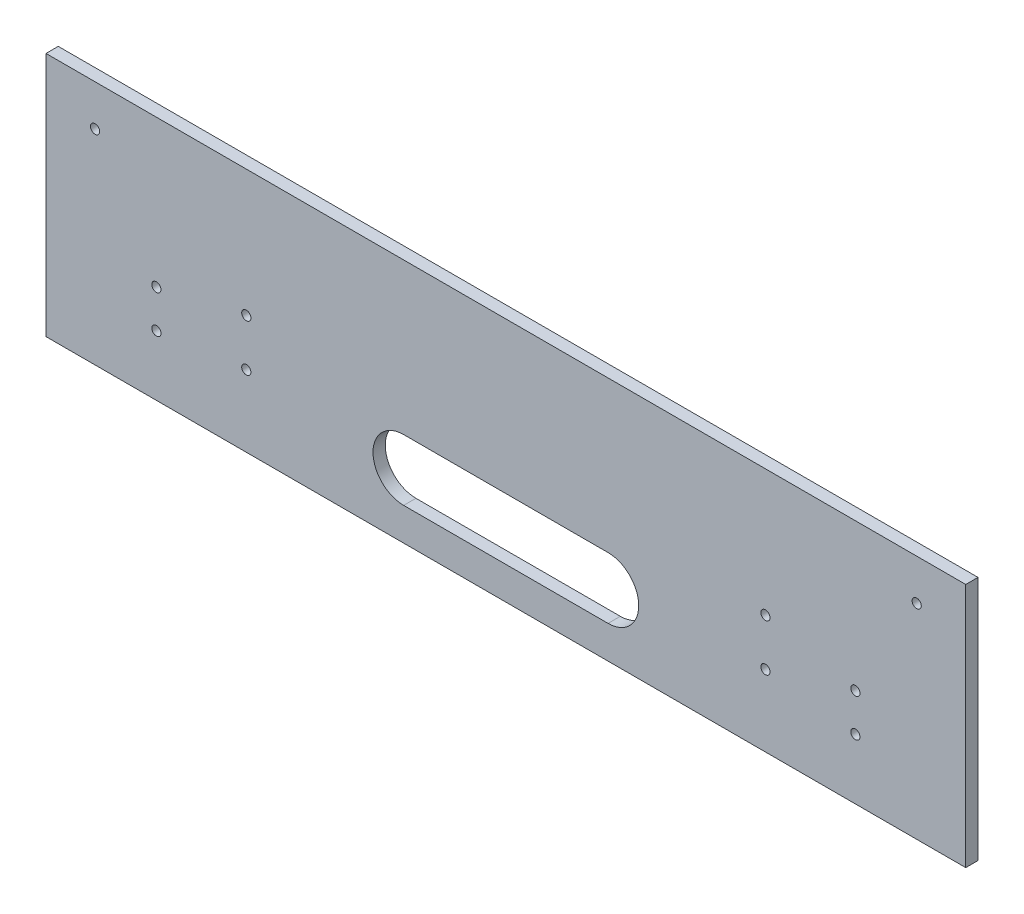
ISO-10303-21;
HEADER;
FILE_DESCRIPTION(('STEP AP214'),'2;1');
FILE_NAME('part.step','',(''),(''),'','','');
FILE_SCHEMA(('AUTOMOTIVE_DESIGN { 1 0 10303 214 1 1 1 1 }'));
ENDSEC;
DATA;
#1=APPLICATION_CONTEXT('core data for automotive mechanical design processes');
#2=APPLICATION_PROTOCOL_DEFINITION('international standard','automotive_design',2000,#1);
#3=PRODUCT_CONTEXT('',#1,'mechanical');
#4=PRODUCT('Part','Part','',(#3));
#5=PRODUCT_RELATED_PRODUCT_CATEGORY('part','',(#4));
#6=PRODUCT_DEFINITION_FORMATION('','',#4);
#7=PRODUCT_DEFINITION_CONTEXT('part definition',#1,'design');
#8=PRODUCT_DEFINITION('design','',#6,#7);
#9=PRODUCT_DEFINITION_SHAPE('','',#8);
#10=(LENGTH_UNIT() NAMED_UNIT(*) SI_UNIT(.MILLI.,.METRE.));
#11=(NAMED_UNIT(*) PLANE_ANGLE_UNIT() SI_UNIT($,.RADIAN.));
#12=(NAMED_UNIT(*) SI_UNIT($,.STERADIAN.) SOLID_ANGLE_UNIT());
#13=UNCERTAINTY_MEASURE_WITH_UNIT(LENGTH_MEASURE(1.E-05),#10,'distance_accuracy_value','');
#14=(GEOMETRIC_REPRESENTATION_CONTEXT(3) GLOBAL_UNCERTAINTY_ASSIGNED_CONTEXT((#13)) GLOBAL_UNIT_ASSIGNED_CONTEXT((#10,
#11,#12)) REPRESENTATION_CONTEXT('',''));
#15=CARTESIAN_POINT('',(0.,0.,0.));
#16=DIRECTION('',(0.,0.,1.));
#17=DIRECTION('',(1.,0.,0.));
#18=AXIS2_PLACEMENT_3D('',#15,#16,#17);
#19=CARTESIAN_POINT('',(-225.,60.,6.));
#20=DIRECTION('',(1.,0.,0.));
#21=DIRECTION('',(0.,0.,-1.));
#22=AXIS2_PLACEMENT_3D('',#19,#20,#21);
#23=PLANE('',#22);
#24=DIRECTION('',(0.,-1.,0.));
#25=VECTOR('',#24,1.);
#26=CARTESIAN_POINT('',(-225.,60.,0.));
#27=LINE('',#26,#25);
#28=CARTESIAN_POINT('',(-225.,60.,0.));
#29=VERTEX_POINT('',#28);
#30=CARTESIAN_POINT('',(-225.,-60.,0.));
#31=VERTEX_POINT('',#30);
#32=EDGE_CURVE('E138',#29,#31,#27,.T.);
#33=ORIENTED_EDGE('',*,*,#32,.T.);
#34=DIRECTION('',(0.,0.,-1.));
#35=VECTOR('',#34,1.);
#36=CARTESIAN_POINT('',(-225.,-60.,6.));
#37=LINE('',#36,#35);
#38=CARTESIAN_POINT('',(-225.,-60.,6.));
#39=VERTEX_POINT('',#38);
#40=EDGE_CURVE('E11',#39,#31,#37,.T.);
#41=ORIENTED_EDGE('',*,*,#40,.F.);
#42=DIRECTION('',(0.,-1.,0.));
#43=VECTOR('',#42,1.);
#44=CARTESIAN_POINT('',(-225.,60.,6.));
#45=LINE('',#44,#43);
#46=CARTESIAN_POINT('',(-225.,60.,6.));
#47=VERTEX_POINT('',#46);
#48=EDGE_CURVE('E139',#47,#39,#45,.T.);
#49=ORIENTED_EDGE('',*,*,#48,.F.);
#50=DIRECTION('',(0.,0.,-1.));
#51=VECTOR('',#50,1.);
#52=CARTESIAN_POINT('',(-225.,60.,6.));
#53=LINE('',#52,#51);
#54=EDGE_CURVE('E149',#47,#29,#53,.T.);
#55=ORIENTED_EDGE('',*,*,#54,.T.);
#56=EDGE_LOOP('',(#33,#41,#49,#55));
#57=FACE_BOUND('',#56,.T.);
#58=ADVANCED_FACE('F37',(#57),#23,.F.);
#59=CARTESIAN_POINT('',(-225.,-60.,6.));
#60=DIRECTION('',(0.,1.,0.));
#61=DIRECTION('',(0.,0.,1.));
#62=AXIS2_PLACEMENT_3D('',#59,#60,#61);
#63=PLANE('',#62);
#64=DIRECTION('',(1.,0.,0.));
#65=VECTOR('',#64,1.);
#66=CARTESIAN_POINT('',(-225.,-60.,0.));
#67=LINE('',#66,#65);
#68=CARTESIAN_POINT('',(225.,-60.,0.));
#69=VERTEX_POINT('',#68);
#70=EDGE_CURVE('E152',#31,#69,#67,.T.);
#71=ORIENTED_EDGE('',*,*,#70,.T.);
#72=DIRECTION('',(0.,0.,-1.));
#73=VECTOR('',#72,1.);
#74=CARTESIAN_POINT('',(225.,-60.,6.));
#75=LINE('',#74,#73);
#76=CARTESIAN_POINT('',(225.,-60.,6.));
#77=VERTEX_POINT('',#76);
#78=EDGE_CURVE('E45',#77,#69,#75,.T.);
#79=ORIENTED_EDGE('',*,*,#78,.F.);
#80=DIRECTION('',(1.,0.,0.));
#81=VECTOR('',#80,1.);
#82=CARTESIAN_POINT('',(-225.,-60.,6.));
#83=LINE('',#82,#81);
#84=EDGE_CURVE('E142',#39,#77,#83,.T.);
#85=ORIENTED_EDGE('',*,*,#84,.F.);
#86=ORIENTED_EDGE('',*,*,#40,.T.);
#87=EDGE_LOOP('',(#71,#79,#85,#86));
#88=FACE_BOUND('',#87,.T.);
#89=ADVANCED_FACE('F248',(#88),#63,.F.);
#90=CARTESIAN_POINT('',(225.,60.,6.));
#91=DIRECTION('',(-1.,0.,0.));
#92=DIRECTION('',(0.,0.,1.));
#93=AXIS2_PLACEMENT_3D('',#90,#91,#92);
#94=PLANE('',#93);
#95=DIRECTION('',(0.,1.,0.));
#96=VECTOR('',#95,1.);
#97=CARTESIAN_POINT('',(225.,60.,0.));
#98=LINE('',#97,#96);
#99=CARTESIAN_POINT('',(225.,60.,0.));
#100=VERTEX_POINT('',#99);
#101=EDGE_CURVE('E154',#69,#100,#98,.T.);
#102=ORIENTED_EDGE('',*,*,#101,.T.);
#103=DIRECTION('',(0.,0.,-1.));
#104=VECTOR('',#103,1.);
#105=CARTESIAN_POINT('',(225.,60.,6.));
#106=LINE('',#105,#104);
#107=CARTESIAN_POINT('',(225.,60.,6.));
#108=VERTEX_POINT('',#107);
#109=EDGE_CURVE('E159',#108,#100,#106,.T.);
#110=ORIENTED_EDGE('',*,*,#109,.F.);
#111=DIRECTION('',(0.,1.,0.));
#112=VECTOR('',#111,1.);
#113=CARTESIAN_POINT('',(225.,60.,6.));
#114=LINE('',#113,#112);
#115=EDGE_CURVE('E145',#77,#108,#114,.T.);
#116=ORIENTED_EDGE('',*,*,#115,.F.);
#117=ORIENTED_EDGE('',*,*,#78,.T.);
#118=EDGE_LOOP('',(#102,#110,#116,#117));
#119=FACE_BOUND('',#118,.T.);
#120=ADVANCED_FACE('F253',(#119),#94,.F.);
#121=CARTESIAN_POINT('',(-225.,60.,6.));
#122=DIRECTION('',(0.,-1.,0.));
#123=DIRECTION('',(0.,0.,-1.));
#124=AXIS2_PLACEMENT_3D('',#121,#122,#123);
#125=PLANE('',#124);
#126=DIRECTION('',(-1.,0.,0.));
#127=VECTOR('',#126,1.);
#128=CARTESIAN_POINT('',(-225.,60.,0.));
#129=LINE('',#128,#127);
#130=EDGE_CURVE('E143',#100,#29,#129,.T.);
#131=ORIENTED_EDGE('',*,*,#130,.T.);
#132=ORIENTED_EDGE('',*,*,#54,.F.);
#133=DIRECTION('',(-1.,0.,0.));
#134=VECTOR('',#133,1.);
#135=CARTESIAN_POINT('',(-225.,60.,6.));
#136=LINE('',#135,#134);
#137=EDGE_CURVE('E147',#108,#47,#136,.T.);
#138=ORIENTED_EDGE('',*,*,#137,.F.);
#139=ORIENTED_EDGE('',*,*,#109,.T.);
#140=EDGE_LOOP('',(#131,#132,#138,#139));
#141=FACE_BOUND('',#140,.T.);
#142=ADVANCED_FACE('F232',(#141),#125,.F.);
#143=CARTESIAN_POINT('',(0.,0.,6.));
#144=DIRECTION('',(0.,0.,1.));
#145=DIRECTION('',(1.,0.,0.));
#146=AXIS2_PLACEMENT_3D('',#143,#144,#145);
#147=PLANE('',#146);
#148=CARTESIAN_POINT('',(-201.,40.,6.));
#149=DIRECTION('',(0.,0.,1.));
#150=DIRECTION('',(1.,0.,0.));
#151=AXIS2_PLACEMENT_3D('',#148,#149,#150);
#152=CIRCLE('',#151,2.25000000000001);
#153=CARTESIAN_POINT('',(-198.75,40.,6.));
#154=VERTEX_POINT('',#153);
#155=EDGE_CURVE('E208',#154,#154,#152,.T.);
#156=ORIENTED_EDGE('',*,*,#155,.F.);
#157=EDGE_LOOP('',(#156));
#158=FACE_BOUND('',#157,.T.);
#159=CARTESIAN_POINT('',(127.,-1.99999999999999,6.));
#160=DIRECTION('',(0.,0.,1.));
#161=DIRECTION('',(1.,0.,0.));
#162=AXIS2_PLACEMENT_3D('',#159,#160,#161);
#163=CIRCLE('',#162,2.25000000000001);
#164=CARTESIAN_POINT('',(129.25,-1.99999999999999,6.));
#165=VERTEX_POINT('',#164);
#166=EDGE_CURVE('E211',#165,#165,#163,.T.);
#167=ORIENTED_EDGE('',*,*,#166,.F.);
#168=EDGE_LOOP('',(#167));
#169=FACE_BOUND('',#168,.T.);
#170=CARTESIAN_POINT('',(127.,-25.,6.));
#171=DIRECTION('',(0.,0.,1.));
#172=DIRECTION('',(1.,0.,0.));
#173=AXIS2_PLACEMENT_3D('',#170,#171,#172);
#174=CIRCLE('',#173,2.25000000000001);
#175=CARTESIAN_POINT('',(129.25,-25.,6.));
#176=VERTEX_POINT('',#175);
#177=EDGE_CURVE('E214',#176,#176,#174,.T.);
#178=ORIENTED_EDGE('',*,*,#177,.F.);
#179=EDGE_LOOP('',(#178));
#180=FACE_BOUND('',#179,.T.);
#181=CARTESIAN_POINT('',(-127.,-1.99999999999999,6.));
#182=DIRECTION('',(0.,0.,1.));
#183=DIRECTION('',(1.,0.,0.));
#184=AXIS2_PLACEMENT_3D('',#181,#182,#183);
#185=CIRCLE('',#184,2.25);
#186=CARTESIAN_POINT('',(-124.75,-1.99999999999999,6.));
#187=VERTEX_POINT('',#186);
#188=EDGE_CURVE('E217',#187,#187,#185,.T.);
#189=ORIENTED_EDGE('',*,*,#188,.F.);
#190=EDGE_LOOP('',(#189));
#191=FACE_BOUND('',#190,.T.);
#192=CARTESIAN_POINT('',(-171.,-30.5,6.));
#193=DIRECTION('',(0.,0.,1.));
#194=DIRECTION('',(1.,0.,0.));
#195=AXIS2_PLACEMENT_3D('',#192,#193,#194);
#196=CIRCLE('',#195,2.25000000000001);
#197=CARTESIAN_POINT('',(-168.75,-30.5,6.));
#198=VERTEX_POINT('',#197);
#199=EDGE_CURVE('E198',#198,#198,#196,.T.);
#200=ORIENTED_EDGE('',*,*,#199,.F.);
#201=EDGE_LOOP('',(#200));
#202=FACE_BOUND('',#201,.T.);
#203=CARTESIAN_POINT('',(171.,-11.9999999999999,6.));
#204=DIRECTION('',(0.,0.,1.));
#205=DIRECTION('',(1.,0.,0.));
#206=AXIS2_PLACEMENT_3D('',#203,#204,#205);
#207=CIRCLE('',#206,2.25000000000001);
#208=CARTESIAN_POINT('',(173.25,-11.9999999999999,6.));
#209=VERTEX_POINT('',#208);
#210=EDGE_CURVE('E199',#209,#209,#207,.T.);
#211=ORIENTED_EDGE('',*,*,#210,.F.);
#212=EDGE_LOOP('',(#211));
#213=FACE_BOUND('',#212,.T.);
#214=CARTESIAN_POINT('',(171.,-30.4999999999999,6.));
#215=DIRECTION('',(0.,0.,1.));
#216=DIRECTION('',(1.,0.,0.));
#217=AXIS2_PLACEMENT_3D('',#214,#215,#216);
#218=CIRCLE('',#217,2.25000000000001);
#219=CARTESIAN_POINT('',(173.25,-30.4999999999999,6.));
#220=VERTEX_POINT('',#219);
#221=EDGE_CURVE('E202',#220,#220,#218,.T.);
#222=ORIENTED_EDGE('',*,*,#221,.F.);
#223=EDGE_LOOP('',(#222));
#224=FACE_BOUND('',#223,.T.);
#225=CARTESIAN_POINT('',(201.,40.,6.));
#226=DIRECTION('',(0.,0.,1.));
#227=DIRECTION('',(1.,0.,0.));
#228=AXIS2_PLACEMENT_3D('',#225,#226,#227);
#229=CIRCLE('',#228,2.25000000000001);
#230=CARTESIAN_POINT('',(203.25,40.,6.));
#231=VERTEX_POINT('',#230);
#232=EDGE_CURVE('E205',#231,#231,#229,.T.);
#233=ORIENTED_EDGE('',*,*,#232,.F.);
#234=EDGE_LOOP('',(#233));
#235=FACE_BOUND('',#234,.T.);
#236=CARTESIAN_POINT('',(-127.,-25.,6.));
#237=DIRECTION('',(0.,0.,1.));
#238=DIRECTION('',(1.,0.,0.));
#239=AXIS2_PLACEMENT_3D('',#236,#237,#238);
#240=CIRCLE('',#239,2.25000000000001);
#241=CARTESIAN_POINT('',(-124.75,-25.,6.));
#242=VERTEX_POINT('',#241);
#243=EDGE_CURVE('E220',#242,#242,#240,.T.);
#244=ORIENTED_EDGE('',*,*,#243,.F.);
#245=EDGE_LOOP('',(#244));
#246=FACE_BOUND('',#245,.T.);
#247=CARTESIAN_POINT('',(-171.,-12.,6.));
#248=DIRECTION('',(0.,0.,1.));
#249=DIRECTION('',(1.,0.,0.));
#250=AXIS2_PLACEMENT_3D('',#247,#248,#249);
#251=CIRCLE('',#250,2.25000000000001);
#252=CARTESIAN_POINT('',(-168.75,-12.,6.));
#253=VERTEX_POINT('',#252);
#254=EDGE_CURVE('E168',#253,#253,#251,.T.);
#255=ORIENTED_EDGE('',*,*,#254,.F.);
#256=EDGE_LOOP('',(#255));
#257=FACE_BOUND('',#256,.T.);
#258=CARTESIAN_POINT('',(50.,-29.,6.));
#259=DIRECTION('',(0.,0.,1.));
#260=DIRECTION('',(1.,0.,0.));
#261=AXIS2_PLACEMENT_3D('',#258,#259,#260);
#262=CIRCLE('',#261,15.);
#263=CARTESIAN_POINT('',(50.,-44.,6.));
#264=VERTEX_POINT('',#263);
#265=CARTESIAN_POINT('',(50.,-14.,6.));
#266=VERTEX_POINT('',#265);
#267=EDGE_CURVE('E136',#264,#266,#262,.T.);
#268=ORIENTED_EDGE('',*,*,#267,.F.);
#269=DIRECTION('',(1.,0.,0.));
#270=VECTOR('',#269,1.);
#271=CARTESIAN_POINT('',(0.,-44.,6.));
#272=LINE('',#271,#270);
#273=CARTESIAN_POINT('',(-50.,-44.,6.));
#274=VERTEX_POINT('',#273);
#275=EDGE_CURVE('E129',#274,#264,#272,.T.);
#276=ORIENTED_EDGE('',*,*,#275,.F.);
#277=CARTESIAN_POINT('',(-50.,-29.,6.));
#278=DIRECTION('',(0.,0.,1.));
#279=DIRECTION('',(1.,0.,0.));
#280=AXIS2_PLACEMENT_3D('',#277,#278,#279);
#281=CIRCLE('',#280,15.);
#282=CARTESIAN_POINT('',(-50.,-14.,6.));
#283=VERTEX_POINT('',#282);
#284=EDGE_CURVE('E109',#283,#274,#281,.T.);
#285=ORIENTED_EDGE('',*,*,#284,.F.);
#286=DIRECTION('',(-1.,0.,0.));
#287=VECTOR('',#286,1.);
#288=CARTESIAN_POINT('',(0.,-14.,6.));
#289=LINE('',#288,#287);
#290=EDGE_CURVE('E134',#266,#283,#289,.T.);
#291=ORIENTED_EDGE('',*,*,#290,.F.);
#292=EDGE_LOOP('',(#268,#276,#285,#291));
#293=FACE_BOUND('',#292,.T.);
#294=ORIENTED_EDGE('',*,*,#48,.T.);
#295=ORIENTED_EDGE('',*,*,#84,.T.);
#296=ORIENTED_EDGE('',*,*,#115,.T.);
#297=ORIENTED_EDGE('',*,*,#137,.T.);
#298=EDGE_LOOP('',(#294,#295,#296,#297));
#299=FACE_BOUND('',#298,.T.);
#300=ADVANCED_FACE('F229',(#158,#169,#180,#191,#202,#213,#224,#235,#246,#257,#293,#299),#147,.T.);
#301=CARTESIAN_POINT('',(0.,0.,0.));
#302=DIRECTION('',(0.,0.,1.));
#303=DIRECTION('',(1.,0.,0.));
#304=AXIS2_PLACEMENT_3D('',#301,#302,#303);
#305=PLANE('',#304);
#306=CARTESIAN_POINT('',(-201.,40.,0.));
#307=DIRECTION('',(0.,0.,1.));
#308=DIRECTION('',(1.,0.,0.));
#309=AXIS2_PLACEMENT_3D('',#306,#307,#308);
#310=CIRCLE('',#309,2.25000000000001);
#311=CARTESIAN_POINT('',(-198.75,40.,0.));
#312=VERTEX_POINT('',#311);
#313=EDGE_CURVE('E40',#312,#312,#310,.T.);
#314=ORIENTED_EDGE('',*,*,#313,.T.);
#315=EDGE_LOOP('',(#314));
#316=FACE_BOUND('',#315,.T.);
#317=CARTESIAN_POINT('',(127.,-1.99999999999999,0.));
#318=DIRECTION('',(0.,0.,1.));
#319=DIRECTION('',(1.,0.,0.));
#320=AXIS2_PLACEMENT_3D('',#317,#318,#319);
#321=CIRCLE('',#320,2.25000000000001);
#322=CARTESIAN_POINT('',(129.25,-1.99999999999999,0.));
#323=VERTEX_POINT('',#322);
#324=EDGE_CURVE('E188',#323,#323,#321,.T.);
#325=ORIENTED_EDGE('',*,*,#324,.T.);
#326=EDGE_LOOP('',(#325));
#327=FACE_BOUND('',#326,.T.);
#328=CARTESIAN_POINT('',(127.,-25.,0.));
#329=DIRECTION('',(0.,0.,1.));
#330=DIRECTION('',(1.,0.,0.));
#331=AXIS2_PLACEMENT_3D('',#328,#329,#330);
#332=CIRCLE('',#331,2.25000000000001);
#333=CARTESIAN_POINT('',(129.25,-25.,0.));
#334=VERTEX_POINT('',#333);
#335=EDGE_CURVE('E186',#334,#334,#332,.T.);
#336=ORIENTED_EDGE('',*,*,#335,.T.);
#337=EDGE_LOOP('',(#336));
#338=FACE_BOUND('',#337,.T.);
#339=CARTESIAN_POINT('',(-127.,-1.99999999999999,0.));
#340=DIRECTION('',(0.,0.,1.));
#341=DIRECTION('',(1.,0.,0.));
#342=AXIS2_PLACEMENT_3D('',#339,#340,#341);
#343=CIRCLE('',#342,2.25);
#344=CARTESIAN_POINT('',(-124.75,-1.99999999999999,0.));
#345=VERTEX_POINT('',#344);
#346=EDGE_CURVE('E183',#345,#345,#343,.T.);
#347=ORIENTED_EDGE('',*,*,#346,.T.);
#348=EDGE_LOOP('',(#347));
#349=FACE_BOUND('',#348,.T.);
#350=CARTESIAN_POINT('',(-171.,-30.5,0.));
#351=DIRECTION('',(0.,0.,1.));
#352=DIRECTION('',(1.,0.,0.));
#353=AXIS2_PLACEMENT_3D('',#350,#351,#352);
#354=CIRCLE('',#353,2.25000000000001);
#355=CARTESIAN_POINT('',(-168.75,-30.5,0.));
#356=VERTEX_POINT('',#355);
#357=EDGE_CURVE('E180',#356,#356,#354,.T.);
#358=ORIENTED_EDGE('',*,*,#357,.T.);
#359=EDGE_LOOP('',(#358));
#360=FACE_BOUND('',#359,.T.);
#361=CARTESIAN_POINT('',(171.,-11.9999999999999,0.));
#362=DIRECTION('',(0.,0.,1.));
#363=DIRECTION('',(1.,0.,0.));
#364=AXIS2_PLACEMENT_3D('',#361,#362,#363);
#365=CIRCLE('',#364,2.25000000000001);
#366=CARTESIAN_POINT('',(173.25,-11.9999999999999,0.));
#367=VERTEX_POINT('',#366);
#368=EDGE_CURVE('E177',#367,#367,#365,.T.);
#369=ORIENTED_EDGE('',*,*,#368,.T.);
#370=EDGE_LOOP('',(#369));
#371=FACE_BOUND('',#370,.T.);
#372=CARTESIAN_POINT('',(171.,-30.4999999999999,0.));
#373=DIRECTION('',(0.,0.,1.));
#374=DIRECTION('',(1.,0.,0.));
#375=AXIS2_PLACEMENT_3D('',#372,#373,#374);
#376=CIRCLE('',#375,2.25000000000001);
#377=CARTESIAN_POINT('',(173.25,-30.4999999999999,0.));
#378=VERTEX_POINT('',#377);
#379=EDGE_CURVE('E174',#378,#378,#376,.T.);
#380=ORIENTED_EDGE('',*,*,#379,.T.);
#381=EDGE_LOOP('',(#380));
#382=FACE_BOUND('',#381,.T.);
#383=CARTESIAN_POINT('',(201.,40.,0.));
#384=DIRECTION('',(0.,0.,1.));
#385=DIRECTION('',(1.,0.,0.));
#386=AXIS2_PLACEMENT_3D('',#383,#384,#385);
#387=CIRCLE('',#386,2.25000000000001);
#388=CARTESIAN_POINT('',(203.25,40.,0.));
#389=VERTEX_POINT('',#388);
#390=EDGE_CURVE('E171',#389,#389,#387,.T.);
#391=ORIENTED_EDGE('',*,*,#390,.T.);
#392=EDGE_LOOP('',(#391));
#393=FACE_BOUND('',#392,.T.);
#394=CARTESIAN_POINT('',(-127.,-25.,0.));
#395=DIRECTION('',(0.,0.,1.));
#396=DIRECTION('',(1.,0.,0.));
#397=AXIS2_PLACEMENT_3D('',#394,#395,#396);
#398=CIRCLE('',#397,2.25000000000001);
#399=CARTESIAN_POINT('',(-124.75,-25.,0.));
#400=VERTEX_POINT('',#399);
#401=EDGE_CURVE('E167',#400,#400,#398,.T.);
#402=ORIENTED_EDGE('',*,*,#401,.T.);
#403=EDGE_LOOP('',(#402));
#404=FACE_BOUND('',#403,.T.);
#405=CARTESIAN_POINT('',(-171.,-12.,0.));
#406=DIRECTION('',(0.,0.,1.));
#407=DIRECTION('',(1.,0.,0.));
#408=AXIS2_PLACEMENT_3D('',#405,#406,#407);
#409=CIRCLE('',#408,2.25000000000001);
#410=CARTESIAN_POINT('',(-168.75,-12.,0.));
#411=VERTEX_POINT('',#410);
#412=EDGE_CURVE('E164',#411,#411,#409,.T.);
#413=ORIENTED_EDGE('',*,*,#412,.T.);
#414=EDGE_LOOP('',(#413));
#415=FACE_BOUND('',#414,.T.);
#416=DIRECTION('',(-1.,0.,0.));
#417=VECTOR('',#416,1.);
#418=CARTESIAN_POINT('',(50.,-44.,0.));
#419=LINE('',#418,#417);
#420=CARTESIAN_POINT('',(50.,-44.,0.));
#421=VERTEX_POINT('',#420);
#422=CARTESIAN_POINT('',(-50.,-44.,0.));
#423=VERTEX_POINT('',#422);
#424=EDGE_CURVE('E115',#421,#423,#419,.T.);
#425=ORIENTED_EDGE('',*,*,#424,.F.);
#426=CARTESIAN_POINT('',(50.,-29.,0.));
#427=DIRECTION('',(0.,0.,-1.));
#428=DIRECTION('',(-1.,0.,0.));
#429=AXIS2_PLACEMENT_3D('',#426,#427,#428);
#430=CIRCLE('',#429,15.);
#431=CARTESIAN_POINT('',(50.,-14.,0.));
#432=VERTEX_POINT('',#431);
#433=EDGE_CURVE('E61',#432,#421,#430,.T.);
#434=ORIENTED_EDGE('',*,*,#433,.F.);
#435=DIRECTION('',(1.,0.,0.));
#436=VECTOR('',#435,1.);
#437=CARTESIAN_POINT('',(50.,-14.,0.));
#438=LINE('',#437,#436);
#439=CARTESIAN_POINT('',(-50.,-14.,0.));
#440=VERTEX_POINT('',#439);
#441=EDGE_CURVE('E122',#440,#432,#438,.T.);
#442=ORIENTED_EDGE('',*,*,#441,.F.);
#443=CARTESIAN_POINT('',(-50.,-29.,0.));
#444=DIRECTION('',(0.,0.,-1.));
#445=DIRECTION('',(-1.,0.,0.));
#446=AXIS2_PLACEMENT_3D('',#443,#444,#445);
#447=CIRCLE('',#446,15.);
#448=EDGE_CURVE('E106',#423,#440,#447,.T.);
#449=ORIENTED_EDGE('',*,*,#448,.F.);
#450=EDGE_LOOP('',(#425,#434,#442,#449));
#451=FACE_BOUND('',#450,.T.);
#452=ORIENTED_EDGE('',*,*,#32,.F.);
#453=ORIENTED_EDGE('',*,*,#130,.F.);
#454=ORIENTED_EDGE('',*,*,#101,.F.);
#455=ORIENTED_EDGE('',*,*,#70,.F.);
#456=EDGE_LOOP('',(#452,#453,#454,#455));
#457=FACE_BOUND('',#456,.T.);
#458=ADVANCED_FACE('F119',(#316,#327,#338,#349,#360,#371,#382,#393,#404,#415,#451,#457),#305,.F.);
#459=CARTESIAN_POINT('',(50.,-29.,10.));
#460=DIRECTION('',(0.,0.,-1.));
#461=DIRECTION('',(-1.,0.,0.));
#462=AXIS2_PLACEMENT_3D('',#459,#460,#461);
#463=CYLINDRICAL_SURFACE('',#462,15.);
#464=ORIENTED_EDGE('',*,*,#267,.T.);
#465=DIRECTION('',(0.,0.,-1.));
#466=VECTOR('',#465,1.);
#467=CARTESIAN_POINT('',(50.,-14.,10.));
#468=LINE('',#467,#466);
#469=EDGE_CURVE('E127',#266,#432,#468,.T.);
#470=ORIENTED_EDGE('',*,*,#469,.T.);
#471=ORIENTED_EDGE('',*,*,#433,.T.);
#472=DIRECTION('',(0.,0.,-1.));
#473=VECTOR('',#472,1.);
#474=CARTESIAN_POINT('',(50.,-44.,10.));
#475=LINE('',#474,#473);
#476=EDGE_CURVE('E112',#264,#421,#475,.T.);
#477=ORIENTED_EDGE('',*,*,#476,.F.);
#478=EDGE_LOOP('',(#464,#470,#471,#477));
#479=FACE_BOUND('',#478,.T.);
#480=ADVANCED_FACE('F257',(#479),#463,.F.);
#481=CARTESIAN_POINT('',(50.,-14.,10.));
#482=DIRECTION('',(0.,1.,0.));
#483=DIRECTION('',(-1.,0.,0.));
#484=AXIS2_PLACEMENT_3D('',#481,#482,#483);
#485=PLANE('',#484);
#486=ORIENTED_EDGE('',*,*,#290,.T.);
#487=DIRECTION('',(0.,0.,-1.));
#488=VECTOR('',#487,1.);
#489=CARTESIAN_POINT('',(-50.,-14.,10.));
#490=LINE('',#489,#488);
#491=EDGE_CURVE('E111',#283,#440,#490,.T.);
#492=ORIENTED_EDGE('',*,*,#491,.T.);
#493=ORIENTED_EDGE('',*,*,#441,.T.);
#494=ORIENTED_EDGE('',*,*,#469,.F.);
#495=EDGE_LOOP('',(#486,#492,#493,#494));
#496=FACE_BOUND('',#495,.T.);
#497=ADVANCED_FACE('F262',(#496),#485,.F.);
#498=CARTESIAN_POINT('',(-50.,-29.,10.));
#499=DIRECTION('',(0.,0.,-1.));
#500=DIRECTION('',(-1.,0.,0.));
#501=AXIS2_PLACEMENT_3D('',#498,#499,#500);
#502=CYLINDRICAL_SURFACE('',#501,15.);
#503=ORIENTED_EDGE('',*,*,#284,.T.);
#504=DIRECTION('',(0.,0.,-1.));
#505=VECTOR('',#504,1.);
#506=CARTESIAN_POINT('',(-50.,-44.,10.));
#507=LINE('',#506,#505);
#508=EDGE_CURVE('E53',#274,#423,#507,.T.);
#509=ORIENTED_EDGE('',*,*,#508,.T.);
#510=ORIENTED_EDGE('',*,*,#448,.T.);
#511=ORIENTED_EDGE('',*,*,#491,.F.);
#512=EDGE_LOOP('',(#503,#509,#510,#511));
#513=FACE_BOUND('',#512,.T.);
#514=ADVANCED_FACE('F103',(#513),#502,.F.);
#515=CARTESIAN_POINT('',(50.,-44.,10.));
#516=DIRECTION('',(0.,-1.,0.));
#517=DIRECTION('',(1.,0.,0.));
#518=AXIS2_PLACEMENT_3D('',#515,#516,#517);
#519=PLANE('',#518);
#520=ORIENTED_EDGE('',*,*,#275,.T.);
#521=ORIENTED_EDGE('',*,*,#476,.T.);
#522=ORIENTED_EDGE('',*,*,#424,.T.);
#523=ORIENTED_EDGE('',*,*,#508,.F.);
#524=EDGE_LOOP('',(#520,#521,#522,#523));
#525=FACE_BOUND('',#524,.T.);
#526=ADVANCED_FACE('F116',(#525),#519,.F.);
#527=CARTESIAN_POINT('',(-171.,-12.,-4.));
#528=DIRECTION('',(0.,0.,1.));
#529=DIRECTION('',(1.,0.,0.));
#530=AXIS2_PLACEMENT_3D('',#527,#528,#529);
#531=CYLINDRICAL_SURFACE('',#530,2.25000000000001);
#532=ORIENTED_EDGE('',*,*,#254,.T.);
#533=EDGE_LOOP('',(#532));
#534=FACE_BOUND('',#533,.T.);
#535=ORIENTED_EDGE('',*,*,#412,.F.);
#536=EDGE_LOOP('',(#535));
#537=FACE_BOUND('',#536,.T.);
#538=ADVANCED_FACE('F300',(#534,#537),#531,.F.);
#539=CARTESIAN_POINT('',(-127.,-25.,-4.));
#540=DIRECTION('',(0.,0.,1.));
#541=DIRECTION('',(1.,0.,0.));
#542=AXIS2_PLACEMENT_3D('',#539,#540,#541);
#543=CYLINDRICAL_SURFACE('',#542,2.25000000000001);
#544=ORIENTED_EDGE('',*,*,#243,.T.);
#545=EDGE_LOOP('',(#544));
#546=FACE_BOUND('',#545,.T.);
#547=ORIENTED_EDGE('',*,*,#401,.F.);
#548=EDGE_LOOP('',(#547));
#549=FACE_BOUND('',#548,.T.);
#550=ADVANCED_FACE('F226',(#546,#549),#543,.F.);
#551=CARTESIAN_POINT('',(201.,40.,-4.));
#552=DIRECTION('',(0.,0.,1.));
#553=DIRECTION('',(1.,0.,0.));
#554=AXIS2_PLACEMENT_3D('',#551,#552,#553);
#555=CYLINDRICAL_SURFACE('',#554,2.25000000000001);
#556=ORIENTED_EDGE('',*,*,#232,.T.);
#557=EDGE_LOOP('',(#556));
#558=FACE_BOUND('',#557,.T.);
#559=ORIENTED_EDGE('',*,*,#390,.F.);
#560=EDGE_LOOP('',(#559));
#561=FACE_BOUND('',#560,.T.);
#562=ADVANCED_FACE('F315',(#558,#561),#555,.F.);
#563=CARTESIAN_POINT('',(171.,-30.4999999999999,-4.));
#564=DIRECTION('',(0.,0.,1.));
#565=DIRECTION('',(1.,0.,0.));
#566=AXIS2_PLACEMENT_3D('',#563,#564,#565);
#567=CYLINDRICAL_SURFACE('',#566,2.25000000000001);
#568=ORIENTED_EDGE('',*,*,#221,.T.);
#569=EDGE_LOOP('',(#568));
#570=FACE_BOUND('',#569,.T.);
#571=ORIENTED_EDGE('',*,*,#379,.F.);
#572=EDGE_LOOP('',(#571));
#573=FACE_BOUND('',#572,.T.);
#574=ADVANCED_FACE('F325',(#570,#573),#567,.F.);
#575=CARTESIAN_POINT('',(171.,-11.9999999999999,-4.));
#576=DIRECTION('',(0.,0.,1.));
#577=DIRECTION('',(1.,0.,0.));
#578=AXIS2_PLACEMENT_3D('',#575,#576,#577);
#579=CYLINDRICAL_SURFACE('',#578,2.25000000000001);
#580=ORIENTED_EDGE('',*,*,#210,.T.);
#581=EDGE_LOOP('',(#580));
#582=FACE_BOUND('',#581,.T.);
#583=ORIENTED_EDGE('',*,*,#368,.F.);
#584=EDGE_LOOP('',(#583));
#585=FACE_BOUND('',#584,.T.);
#586=ADVANCED_FACE('F336',(#582,#585),#579,.F.);
#587=CARTESIAN_POINT('',(-171.,-30.5,-4.));
#588=DIRECTION('',(0.,0.,1.));
#589=DIRECTION('',(1.,0.,0.));
#590=AXIS2_PLACEMENT_3D('',#587,#588,#589);
#591=CYLINDRICAL_SURFACE('',#590,2.25000000000001);
#592=ORIENTED_EDGE('',*,*,#199,.T.);
#593=EDGE_LOOP('',(#592));
#594=FACE_BOUND('',#593,.T.);
#595=ORIENTED_EDGE('',*,*,#357,.F.);
#596=EDGE_LOOP('',(#595));
#597=FACE_BOUND('',#596,.T.);
#598=ADVANCED_FACE('F347',(#594,#597),#591,.F.);
#599=CARTESIAN_POINT('',(-127.,-1.99999999999999,-4.));
#600=DIRECTION('',(0.,0.,1.));
#601=DIRECTION('',(1.,0.,0.));
#602=AXIS2_PLACEMENT_3D('',#599,#600,#601);
#603=CYLINDRICAL_SURFACE('',#602,2.25);
#604=ORIENTED_EDGE('',*,*,#188,.T.);
#605=EDGE_LOOP('',(#604));
#606=FACE_BOUND('',#605,.T.);
#607=ORIENTED_EDGE('',*,*,#346,.F.);
#608=EDGE_LOOP('',(#607));
#609=FACE_BOUND('',#608,.T.);
#610=ADVANCED_FACE('F358',(#606,#609),#603,.F.);
#611=CARTESIAN_POINT('',(127.,-25.,-4.));
#612=DIRECTION('',(0.,0.,1.));
#613=DIRECTION('',(1.,0.,0.));
#614=AXIS2_PLACEMENT_3D('',#611,#612,#613);
#615=CYLINDRICAL_SURFACE('',#614,2.25000000000001);
#616=ORIENTED_EDGE('',*,*,#177,.T.);
#617=EDGE_LOOP('',(#616));
#618=FACE_BOUND('',#617,.T.);
#619=ORIENTED_EDGE('',*,*,#335,.F.);
#620=EDGE_LOOP('',(#619));
#621=FACE_BOUND('',#620,.T.);
#622=ADVANCED_FACE('F369',(#618,#621),#615,.F.);
#623=CARTESIAN_POINT('',(127.,-1.99999999999999,-4.));
#624=DIRECTION('',(0.,0.,1.));
#625=DIRECTION('',(1.,0.,0.));
#626=AXIS2_PLACEMENT_3D('',#623,#624,#625);
#627=CYLINDRICAL_SURFACE('',#626,2.25000000000001);
#628=ORIENTED_EDGE('',*,*,#166,.T.);
#629=EDGE_LOOP('',(#628));
#630=FACE_BOUND('',#629,.T.);
#631=ORIENTED_EDGE('',*,*,#324,.F.);
#632=EDGE_LOOP('',(#631));
#633=FACE_BOUND('',#632,.T.);
#634=ADVANCED_FACE('F380',(#630,#633),#627,.F.);
#635=CARTESIAN_POINT('',(-201.,40.,-4.));
#636=DIRECTION('',(0.,0.,1.));
#637=DIRECTION('',(1.,0.,0.));
#638=AXIS2_PLACEMENT_3D('',#635,#636,#637);
#639=CYLINDRICAL_SURFACE('',#638,2.25000000000001);
#640=ORIENTED_EDGE('',*,*,#155,.T.);
#641=EDGE_LOOP('',(#640));
#642=FACE_BOUND('',#641,.T.);
#643=ORIENTED_EDGE('',*,*,#313,.F.);
#644=EDGE_LOOP('',(#643));
#645=FACE_BOUND('',#644,.T.);
#646=ADVANCED_FACE('F391',(#642,#645),#639,.F.);
#647=CLOSED_SHELL('',(#58,#89,#120,#142,#300,#458,#480,#497,#514,#526,#538,#550,#562,#574,#586,
#598,#610,#622,#634,#646));
#648=MANIFOLD_SOLID_BREP('B2',#647);
#649=ADVANCED_BREP_SHAPE_REPRESENTATION('',(#18,#648),#14);
#650=SHAPE_DEFINITION_REPRESENTATION(#9,#649);
ENDSEC;
END-ISO-10303-21;
